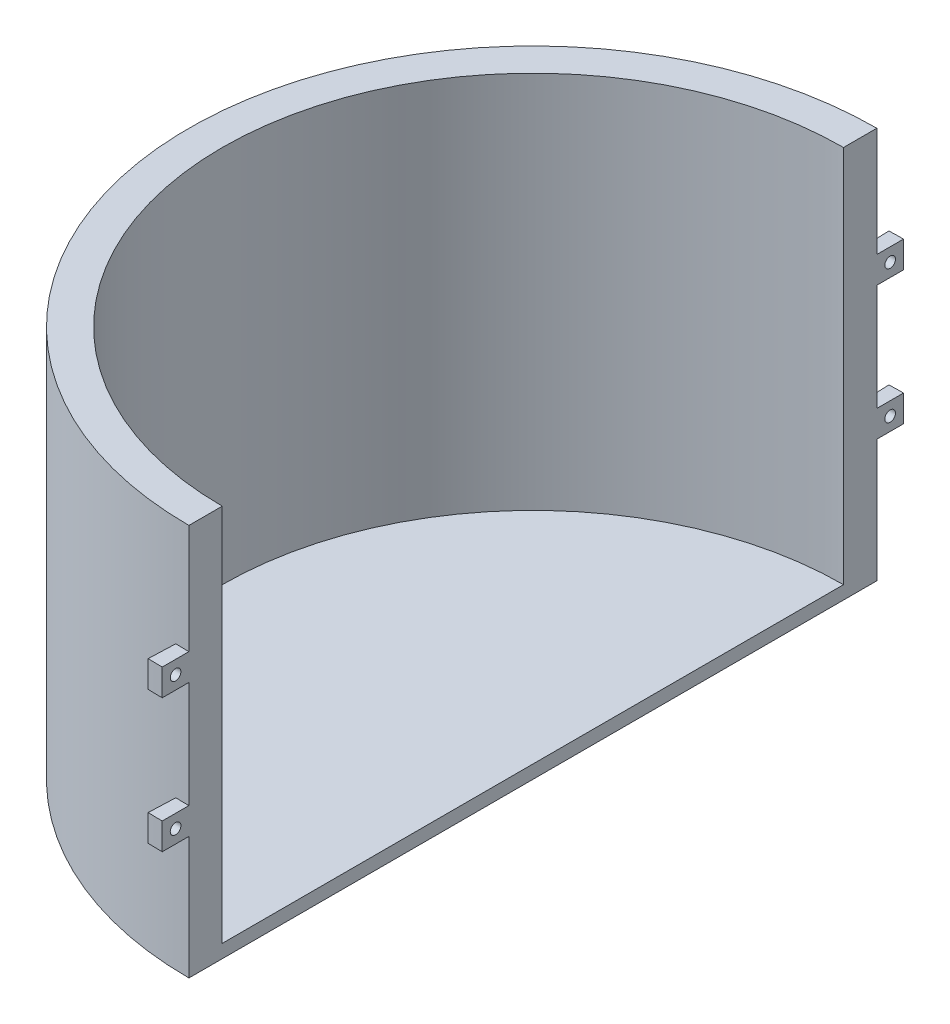
ISO-10303-21;
HEADER;
FILE_DESCRIPTION(('STEP AP214'),'2;1');
FILE_NAME('part.step','',(''),(''),'','','');
FILE_SCHEMA(('AUTOMOTIVE_DESIGN { 1 0 10303 214 1 1 1 1 }'));
ENDSEC;
DATA;
#1=APPLICATION_CONTEXT('core data for automotive mechanical design processes');
#2=APPLICATION_PROTOCOL_DEFINITION('international standard','automotive_design',2000,#1);
#3=PRODUCT_CONTEXT('',#1,'mechanical');
#4=PRODUCT('Part','Part','',(#3));
#5=PRODUCT_RELATED_PRODUCT_CATEGORY('part','',(#4));
#6=PRODUCT_DEFINITION_FORMATION('','',#4);
#7=PRODUCT_DEFINITION_CONTEXT('part definition',#1,'design');
#8=PRODUCT_DEFINITION('design','',#6,#7);
#9=PRODUCT_DEFINITION_SHAPE('','',#8);
#10=(LENGTH_UNIT() NAMED_UNIT(*) SI_UNIT(.MILLI.,.METRE.));
#11=(NAMED_UNIT(*) PLANE_ANGLE_UNIT() SI_UNIT($,.RADIAN.));
#12=(NAMED_UNIT(*) SI_UNIT($,.STERADIAN.) SOLID_ANGLE_UNIT());
#13=UNCERTAINTY_MEASURE_WITH_UNIT(LENGTH_MEASURE(1.E-05),#10,'distance_accuracy_value','');
#14=(GEOMETRIC_REPRESENTATION_CONTEXT(3) GLOBAL_UNCERTAINTY_ASSIGNED_CONTEXT((#13)) GLOBAL_UNIT_ASSIGNED_CONTEXT((#10,
#11,#12)) REPRESENTATION_CONTEXT('',''));
#15=CARTESIAN_POINT('',(0.,0.,0.));
#16=DIRECTION('',(0.,0.,1.));
#17=DIRECTION('',(1.,0.,0.));
#18=AXIS2_PLACEMENT_3D('',#15,#16,#17);
#19=CARTESIAN_POINT('',(0.,180.,129.));
#20=DIRECTION('',(-1.,0.,0.));
#21=DIRECTION('',(0.,0.,1.));
#22=AXIS2_PLACEMENT_3D('',#19,#20,#21);
#23=PLANE('',#22);
#24=CARTESIAN_POINT('',(0.,65.,134.));
#25=DIRECTION('',(1.,0.,0.));
#26=DIRECTION('',(0.,0.,1.));
#27=AXIS2_PLACEMENT_3D('',#24,#25,#26);
#28=CIRCLE('',#27,2.);
#29=CARTESIAN_POINT('',(0.,65.,136.));
#30=VERTEX_POINT('',#29);
#31=EDGE_CURVE('E431',#30,#30,#28,.T.);
#32=ORIENTED_EDGE('',*,*,#31,.F.);
#33=EDGE_LOOP('',(#32));
#34=FACE_BOUND('',#33,.T.);
#35=CARTESIAN_POINT('',(0.,115.,-134.));
#36=DIRECTION('',(1.,0.,0.));
#37=DIRECTION('',(0.,0.,1.));
#38=AXIS2_PLACEMENT_3D('',#35,#36,#37);
#39=CIRCLE('',#38,2.);
#40=CARTESIAN_POINT('',(0.,115.,-132.));
#41=VERTEX_POINT('',#40);
#42=EDGE_CURVE('E428',#41,#41,#39,.T.);
#43=ORIENTED_EDGE('',*,*,#42,.F.);
#44=EDGE_LOOP('',(#43));
#45=FACE_BOUND('',#44,.T.);
#46=CARTESIAN_POINT('',(0.,65.,-134.));
#47=DIRECTION('',(1.,0.,0.));
#48=DIRECTION('',(0.,0.,-1.));
#49=AXIS2_PLACEMENT_3D('',#46,#47,#48);
#50=CIRCLE('',#49,2.);
#51=CARTESIAN_POINT('',(0.,65.,-136.));
#52=VERTEX_POINT('',#51);
#53=EDGE_CURVE('E425',#52,#52,#50,.T.);
#54=ORIENTED_EDGE('',*,*,#53,.F.);
#55=EDGE_LOOP('',(#54));
#56=FACE_BOUND('',#55,.T.);
#57=CARTESIAN_POINT('',(0.,115.,134.));
#58=DIRECTION('',(1.,0.,0.));
#59=DIRECTION('',(0.,0.,-1.));
#60=AXIS2_PLACEMENT_3D('',#57,#58,#59);
#61=CIRCLE('',#60,2.);
#62=CARTESIAN_POINT('',(0.,115.,132.));
#63=VERTEX_POINT('',#62);
#64=EDGE_CURVE('E280',#63,#63,#61,.T.);
#65=ORIENTED_EDGE('',*,*,#64,.F.);
#66=EDGE_LOOP('',(#65));
#67=FACE_BOUND('',#66,.T.);
#68=DIRECTION('',(0.,-1.,0.));
#69=VECTOR('',#68,1.);
#70=CARTESIAN_POINT('',(0.,180.,-129.));
#71=LINE('',#70,#69);
#72=CARTESIAN_POINT('',(0.,161.,-129.));
#73=VERTEX_POINT('',#72);
#74=CARTESIAN_POINT('',(0.,120.,-129.));
#75=VERTEX_POINT('',#74);
#76=EDGE_CURVE('E252',#73,#75,#71,.T.);
#77=ORIENTED_EDGE('',*,*,#76,.F.);
#78=DIRECTION('',(0.,0.,1.));
#79=VECTOR('',#78,1.);
#80=CARTESIAN_POINT('',(0.,161.,129.));
#81=LINE('',#80,#79);
#82=CARTESIAN_POINT('',(0.,161.,-116.5));
#83=VERTEX_POINT('',#82);
#84=EDGE_CURVE('E238',#73,#83,#81,.T.);
#85=ORIENTED_EDGE('',*,*,#84,.T.);
#86=DIRECTION('',(0.,1.,0.));
#87=VECTOR('',#86,1.);
#88=CARTESIAN_POINT('',(0.,180.,-116.5));
#89=LINE('',#88,#87);
#90=CARTESIAN_POINT('',(0.,19.,-116.5));
#91=VERTEX_POINT('',#90);
#92=EDGE_CURVE('E111',#83,#91,#89,.F.);
#93=ORIENTED_EDGE('',*,*,#92,.T.);
#94=DIRECTION('',(0.,0.,1.));
#95=VECTOR('',#94,1.);
#96=CARTESIAN_POINT('',(0.,19.,129.));
#97=LINE('',#96,#95);
#98=CARTESIAN_POINT('',(0.,19.,116.5));
#99=VERTEX_POINT('',#98);
#100=EDGE_CURVE('E273',#91,#99,#97,.T.);
#101=ORIENTED_EDGE('',*,*,#100,.T.);
#102=DIRECTION('',(0.,-1.,0.));
#103=VECTOR('',#102,1.);
#104=CARTESIAN_POINT('',(0.,0.,116.5));
#105=LINE('',#104,#103);
#106=CARTESIAN_POINT('',(0.,161.,116.5));
#107=VERTEX_POINT('',#106);
#108=EDGE_CURVE('E411',#107,#99,#105,.T.);
#109=ORIENTED_EDGE('',*,*,#108,.F.);
#110=CARTESIAN_POINT('',(0.,161.,129.));
#111=VERTEX_POINT('',#110);
#112=EDGE_CURVE('E250',#107,#111,#81,.T.);
#113=ORIENTED_EDGE('',*,*,#112,.T.);
#114=DIRECTION('',(0.,-1.,0.));
#115=VECTOR('',#114,1.);
#116=CARTESIAN_POINT('',(0.,180.,129.));
#117=LINE('',#116,#115);
#118=CARTESIAN_POINT('',(0.,120.,129.));
#119=VERTEX_POINT('',#118);
#120=EDGE_CURVE('E255',#111,#119,#117,.T.);
#121=ORIENTED_EDGE('',*,*,#120,.T.);
#122=DIRECTION('',(0.,0.,-1.));
#123=VECTOR('',#122,1.);
#124=CARTESIAN_POINT('',(0.,120.,129.));
#125=LINE('',#124,#123);
#126=CARTESIAN_POINT('',(0.,120.,139.));
#127=VERTEX_POINT('',#126);
#128=EDGE_CURVE('E376',#127,#119,#125,.T.);
#129=ORIENTED_EDGE('',*,*,#128,.F.);
#130=DIRECTION('',(0.,-1.,0.));
#131=VECTOR('',#130,1.);
#132=CARTESIAN_POINT('',(0.,180.,139.));
#133=LINE('',#132,#131);
#134=CARTESIAN_POINT('',(0.,110.,139.));
#135=VERTEX_POINT('',#134);
#136=EDGE_CURVE('E359',#127,#135,#133,.T.);
#137=ORIENTED_EDGE('',*,*,#136,.T.);
#138=DIRECTION('',(0.,0.,-1.));
#139=VECTOR('',#138,1.);
#140=CARTESIAN_POINT('',(0.,110.,129.));
#141=LINE('',#140,#139);
#142=CARTESIAN_POINT('',(0.,110.,129.));
#143=VERTEX_POINT('',#142);
#144=EDGE_CURVE('E374',#135,#143,#141,.T.);
#145=ORIENTED_EDGE('',*,*,#144,.T.);
#146=CARTESIAN_POINT('',(0.,70.,129.));
#147=VERTEX_POINT('',#146);
#148=EDGE_CURVE('E262',#143,#147,#117,.T.);
#149=ORIENTED_EDGE('',*,*,#148,.T.);
#150=DIRECTION('',(0.,0.,1.));
#151=VECTOR('',#150,1.);
#152=CARTESIAN_POINT('',(0.,70.,129.));
#153=LINE('',#152,#151);
#154=CARTESIAN_POINT('',(0.,70.0000000000001,139.));
#155=VERTEX_POINT('',#154);
#156=EDGE_CURVE('E409',#147,#155,#153,.T.);
#157=ORIENTED_EDGE('',*,*,#156,.T.);
#158=DIRECTION('',(0.,-1.,0.));
#159=VECTOR('',#158,1.);
#160=CARTESIAN_POINT('',(0.,180.,139.));
#161=LINE('',#160,#159);
#162=CARTESIAN_POINT('',(0.,60.0000000000001,139.));
#163=VERTEX_POINT('',#162);
#164=EDGE_CURVE('E387',#155,#163,#161,.T.);
#165=ORIENTED_EDGE('',*,*,#164,.T.);
#166=DIRECTION('',(0.,0.,1.));
#167=VECTOR('',#166,1.);
#168=CARTESIAN_POINT('',(0.,60.0000000000001,129.));
#169=LINE('',#168,#167);
#170=CARTESIAN_POINT('',(0.,60.0000000000001,129.));
#171=VERTEX_POINT('',#170);
#172=EDGE_CURVE('E392',#171,#163,#169,.T.);
#173=ORIENTED_EDGE('',*,*,#172,.F.);
#174=CARTESIAN_POINT('',(0.,14.0000000000001,129.));
#175=VERTEX_POINT('',#174);
#176=EDGE_CURVE('E259',#171,#175,#117,.T.);
#177=ORIENTED_EDGE('',*,*,#176,.T.);
#178=DIRECTION('',(0.,0.,-1.));
#179=VECTOR('',#178,1.);
#180=CARTESIAN_POINT('',(0.,14.,129.));
#181=LINE('',#180,#179);
#182=CARTESIAN_POINT('',(0.,14.,-129.));
#183=VERTEX_POINT('',#182);
#184=EDGE_CURVE('E117',#175,#183,#181,.T.);
#185=ORIENTED_EDGE('',*,*,#184,.T.);
#186=CARTESIAN_POINT('',(0.,60.0000000000001,-129.));
#187=VERTEX_POINT('',#186);
#188=EDGE_CURVE('E264',#187,#183,#71,.T.);
#189=ORIENTED_EDGE('',*,*,#188,.F.);
#190=DIRECTION('',(0.,0.,-1.));
#191=VECTOR('',#190,1.);
#192=CARTESIAN_POINT('',(0.,60.0000000000001,-129.));
#193=LINE('',#192,#191);
#194=CARTESIAN_POINT('',(0.,60.0000000000001,-139.));
#195=VERTEX_POINT('',#194);
#196=EDGE_CURVE('E339',#187,#195,#193,.T.);
#197=ORIENTED_EDGE('',*,*,#196,.T.);
#198=DIRECTION('',(0.,-1.,0.));
#199=VECTOR('',#198,1.);
#200=CARTESIAN_POINT('',(0.,180.,-139.));
#201=LINE('',#200,#199);
#202=CARTESIAN_POINT('',(0.,70.,-139.));
#203=VERTEX_POINT('',#202);
#204=EDGE_CURVE('E323',#203,#195,#201,.T.);
#205=ORIENTED_EDGE('',*,*,#204,.F.);
#206=DIRECTION('',(0.,0.,-1.));
#207=VECTOR('',#206,1.);
#208=CARTESIAN_POINT('',(0.,70.,-129.));
#209=LINE('',#208,#207);
#210=CARTESIAN_POINT('',(0.,70.,-129.));
#211=VERTEX_POINT('',#210);
#212=EDGE_CURVE('E341',#211,#203,#209,.T.);
#213=ORIENTED_EDGE('',*,*,#212,.F.);
#214=CARTESIAN_POINT('',(0.,110.,-129.));
#215=VERTEX_POINT('',#214);
#216=EDGE_CURVE('E260',#215,#211,#71,.T.);
#217=ORIENTED_EDGE('',*,*,#216,.F.);
#218=DIRECTION('',(0.,0.,1.));
#219=VECTOR('',#218,1.);
#220=CARTESIAN_POINT('',(0.,110.,-129.));
#221=LINE('',#220,#219);
#222=CARTESIAN_POINT('',(0.,110.,-139.));
#223=VERTEX_POINT('',#222);
#224=EDGE_CURVE('E312',#223,#215,#221,.T.);
#225=ORIENTED_EDGE('',*,*,#224,.F.);
#226=DIRECTION('',(0.,-1.,0.));
#227=VECTOR('',#226,1.);
#228=CARTESIAN_POINT('',(0.,180.,-139.));
#229=LINE('',#228,#227);
#230=CARTESIAN_POINT('',(0.,120.,-139.));
#231=VERTEX_POINT('',#230);
#232=EDGE_CURVE('E291',#231,#223,#229,.T.);
#233=ORIENTED_EDGE('',*,*,#232,.F.);
#234=DIRECTION('',(0.,0.,1.));
#235=VECTOR('',#234,1.);
#236=CARTESIAN_POINT('',(0.,120.,-129.));
#237=LINE('',#236,#235);
#238=EDGE_CURVE('E258',#231,#75,#237,.T.);
#239=ORIENTED_EDGE('',*,*,#238,.T.);
#240=EDGE_LOOP('',(#77,#85,#93,#101,#109,#113,#121,#129,#137,#145,#149,#157,#165,#173,#177,#185,
#189,#197,#205,#213,#217,#225,#233,#239));
#241=FACE_BOUND('',#240,.T.);
#242=ADVANCED_FACE('F103',(#34,#45,#56,#67,#241),#23,.F.);
#243=CARTESIAN_POINT('',(0.,180.,0.));
#244=DIRECTION('',(0.,-1.,0.));
#245=DIRECTION('',(0.,0.,-1.));
#246=AXIS2_PLACEMENT_3D('',#243,#244,#245);
#247=CYLINDRICAL_SURFACE('',#246,129.);
#248=ORIENTED_EDGE('',*,*,#120,.F.);
#249=CARTESIAN_POINT('',(0.,161.,0.));
#250=DIRECTION('',(0.,-1.,0.));
#251=DIRECTION('',(0.,0.,-1.));
#252=AXIS2_PLACEMENT_3D('',#249,#250,#251);
#253=CIRCLE('',#252,129.);
#254=EDGE_CURVE('E241',#111,#73,#253,.T.);
#255=ORIENTED_EDGE('',*,*,#254,.T.);
#256=ORIENTED_EDGE('',*,*,#76,.T.);
#257=CARTESIAN_POINT('',(0.,120.,0.));
#258=DIRECTION('',(0.,-1.,0.));
#259=DIRECTION('',(0.,0.,-1.));
#260=AXIS2_PLACEMENT_3D('',#257,#258,#259);
#261=CIRCLE('',#260,129.);
#262=CARTESIAN_POINT('',(-4.99874816606519,120.,-128.903112905671));
#263=VERTEX_POINT('',#262);
#264=EDGE_CURVE('E124',#263,#75,#261,.T.);
#265=ORIENTED_EDGE('',*,*,#264,.F.);
#266=DIRECTION('',(0.,-1.,0.));
#267=VECTOR('',#266,1.);
#268=CARTESIAN_POINT('',(-4.99874816606519,120.,-128.903112905671));
#269=LINE('',#268,#267);
#270=CARTESIAN_POINT('',(-4.99874816606519,110.,-128.903112905671));
#271=VERTEX_POINT('',#270);
#272=EDGE_CURVE('E317',#263,#271,#269,.T.);
#273=ORIENTED_EDGE('',*,*,#272,.T.);
#274=CARTESIAN_POINT('',(0.,110.,0.));
#275=DIRECTION('',(0.,-1.,0.));
#276=DIRECTION('',(0.,0.,-1.));
#277=AXIS2_PLACEMENT_3D('',#274,#275,#276);
#278=CIRCLE('',#277,129.);
#279=EDGE_CURVE('E301',#271,#215,#278,.T.);
#280=ORIENTED_EDGE('',*,*,#279,.T.);
#281=ORIENTED_EDGE('',*,*,#216,.T.);
#282=CARTESIAN_POINT('',(0.,70.,0.));
#283=DIRECTION('',(0.,-1.,0.));
#284=DIRECTION('',(0.,0.,-1.));
#285=AXIS2_PLACEMENT_3D('',#282,#283,#284);
#286=CIRCLE('',#285,129.);
#287=CARTESIAN_POINT('',(-4.99874816606522,70.,-128.903112905671));
#288=VERTEX_POINT('',#287);
#289=EDGE_CURVE('E322',#288,#211,#286,.T.);
#290=ORIENTED_EDGE('',*,*,#289,.F.);
#291=DIRECTION('',(0.,-1.,0.));
#292=VECTOR('',#291,1.);
#293=CARTESIAN_POINT('',(-4.99874816606519,70.,-128.903112905671));
#294=LINE('',#293,#292);
#295=CARTESIAN_POINT('',(-4.99874816606519,60.,-128.903112905671));
#296=VERTEX_POINT('',#295);
#297=EDGE_CURVE('E334',#288,#296,#294,.T.);
#298=ORIENTED_EDGE('',*,*,#297,.T.);
#299=CARTESIAN_POINT('',(0.,60.,0.));
#300=DIRECTION('',(0.,-1.,0.));
#301=DIRECTION('',(0.,0.,-1.));
#302=AXIS2_PLACEMENT_3D('',#299,#300,#301);
#303=CIRCLE('',#302,129.);
#304=EDGE_CURVE('E315',#296,#187,#303,.T.);
#305=ORIENTED_EDGE('',*,*,#304,.T.);
#306=ORIENTED_EDGE('',*,*,#188,.T.);
#307=CARTESIAN_POINT('',(0.,14.,0.));
#308=DIRECTION('',(0.,1.,0.));
#309=DIRECTION('',(0.,0.,1.));
#310=AXIS2_PLACEMENT_3D('',#307,#308,#309);
#311=CIRCLE('',#310,129.);
#312=EDGE_CURVE('E13',#183,#175,#311,.T.);
#313=ORIENTED_EDGE('',*,*,#312,.T.);
#314=ORIENTED_EDGE('',*,*,#176,.F.);
#315=CARTESIAN_POINT('',(0.,60.,0.));
#316=DIRECTION('',(0.,-1.,0.));
#317=DIRECTION('',(-0.0387499857834649,0.,0.999248937253266));
#318=AXIS2_PLACEMENT_3D('',#315,#316,#317);
#319=CIRCLE('',#318,129.);
#320=CARTESIAN_POINT('',(-4.99874816606697,60.,128.903112905671));
#321=VERTEX_POINT('',#320);
#322=EDGE_CURVE('E382',#171,#321,#319,.T.);
#323=ORIENTED_EDGE('',*,*,#322,.T.);
#324=DIRECTION('',(0.,-1.,0.));
#325=VECTOR('',#324,1.);
#326=CARTESIAN_POINT('',(-4.99874816606697,70.,128.903112905671));
#327=LINE('',#326,#325);
#328=CARTESIAN_POINT('',(-4.99874816606697,70.,128.903112905671));
#329=VERTEX_POINT('',#328);
#330=EDGE_CURVE('E388',#329,#321,#327,.T.);
#331=ORIENTED_EDGE('',*,*,#330,.F.);
#332=CARTESIAN_POINT('',(0.,70.,0.));
#333=DIRECTION('',(0.,-1.,0.));
#334=DIRECTION('',(-0.0387499857834649,0.,0.999248937253266));
#335=AXIS2_PLACEMENT_3D('',#332,#333,#334);
#336=CIRCLE('',#335,129.);
#337=EDGE_CURVE('E400',#147,#329,#336,.T.);
#338=ORIENTED_EDGE('',*,*,#337,.F.);
#339=ORIENTED_EDGE('',*,*,#148,.F.);
#340=CARTESIAN_POINT('',(0.,110.,0.));
#341=DIRECTION('',(0.,-1.,0.));
#342=DIRECTION('',(-0.0387499857834649,0.,0.999248937253266));
#343=AXIS2_PLACEMENT_3D('',#340,#341,#342);
#344=CIRCLE('',#343,129.);
#345=CARTESIAN_POINT('',(-4.99874816606697,110.,128.903112905671));
#346=VERTEX_POINT('',#345);
#347=EDGE_CURVE('E355',#143,#346,#344,.T.);
#348=ORIENTED_EDGE('',*,*,#347,.T.);
#349=DIRECTION('',(0.,-1.,0.));
#350=VECTOR('',#349,1.);
#351=CARTESIAN_POINT('',(-4.99874816606697,120.,128.903112905671));
#352=LINE('',#351,#350);
#353=CARTESIAN_POINT('',(-4.99874816606697,120.,128.903112905671));
#354=VERTEX_POINT('',#353);
#355=EDGE_CURVE('E351',#354,#346,#352,.T.);
#356=ORIENTED_EDGE('',*,*,#355,.F.);
#357=CARTESIAN_POINT('',(0.,120.,0.));
#358=DIRECTION('',(0.,-1.,0.));
#359=DIRECTION('',(-0.0387499857834649,0.,0.999248937253266));
#360=AXIS2_PLACEMENT_3D('',#357,#358,#359);
#361=CIRCLE('',#360,129.);
#362=EDGE_CURVE('E347',#119,#354,#361,.T.);
#363=ORIENTED_EDGE('',*,*,#362,.F.);
#364=EDGE_LOOP('',(#248,#255,#256,#265,#273,#280,#281,#290,#298,#305,#306,#313,#314,#323,#331,
#338,#339,#348,#356,#363));
#365=FACE_BOUND('',#364,.T.);
#366=ADVANCED_FACE('F105',(#365),#247,.T.);
#367=CARTESIAN_POINT('',(0.,180.,0.));
#368=DIRECTION('',(0.,1.,0.));
#369=DIRECTION('',(0.,0.,1.));
#370=AXIS2_PLACEMENT_3D('',#367,#368,#369);
#371=CYLINDRICAL_SURFACE('',#370,116.5);
#372=CARTESIAN_POINT('',(0.,161.,0.));
#373=DIRECTION('',(0.,1.,0.));
#374=DIRECTION('',(0.,0.,1.));
#375=AXIS2_PLACEMENT_3D('',#372,#373,#374);
#376=CIRCLE('',#375,116.5);
#377=EDGE_CURVE('E244',#83,#107,#376,.T.);
#378=ORIENTED_EDGE('',*,*,#377,.T.);
#379=ORIENTED_EDGE('',*,*,#108,.T.);
#380=CARTESIAN_POINT('',(0.,19.,0.));
#381=DIRECTION('',(0.,1.,0.));
#382=DIRECTION('',(0.,0.,1.));
#383=AXIS2_PLACEMENT_3D('',#380,#381,#382);
#384=CIRCLE('',#383,116.5);
#385=EDGE_CURVE('E414',#91,#99,#384,.T.);
#386=ORIENTED_EDGE('',*,*,#385,.F.);
#387=ORIENTED_EDGE('',*,*,#92,.F.);
#388=EDGE_LOOP('',(#378,#379,#386,#387));
#389=FACE_BOUND('',#388,.T.);
#390=ADVANCED_FACE('F468',(#389),#371,.F.);
#391=CARTESIAN_POINT('',(0.,19.,0.));
#392=DIRECTION('',(0.,-1.,0.));
#393=DIRECTION('',(0.,0.,-1.));
#394=AXIS2_PLACEMENT_3D('',#391,#392,#393);
#395=PLANE('',#394);
#396=ORIENTED_EDGE('',*,*,#385,.T.);
#397=ORIENTED_EDGE('',*,*,#100,.F.);
#398=EDGE_LOOP('',(#396,#397));
#399=FACE_BOUND('',#398,.T.);
#400=ADVANCED_FACE('F474',(#399),#395,.F.);
#401=CARTESIAN_POINT('',(0.,70.,0.));
#402=DIRECTION('',(0.,1.,0.));
#403=DIRECTION('',(0.,0.,1.));
#404=AXIS2_PLACEMENT_3D('',#401,#402,#403);
#405=PLANE('',#404);
#406=ORIENTED_EDGE('',*,*,#156,.F.);
#407=ORIENTED_EDGE('',*,*,#337,.T.);
#408=DIRECTION('',(-0.0387499857834649,0.,0.999248937253266));
#409=VECTOR('',#408,1.);
#410=CARTESIAN_POINT('',(-4.99874816606697,70.,128.903112905671));
#411=LINE('',#410,#409);
#412=CARTESIAN_POINT('',(-5.38624802390156,70.0000000000001,138.895602278204));
#413=VERTEX_POINT('',#412);
#414=EDGE_CURVE('E407',#329,#413,#411,.T.);
#415=ORIENTED_EDGE('',*,*,#414,.T.);
#416=CARTESIAN_POINT('',(0.,70.0000000000001,0.));
#417=DIRECTION('',(0.,-1.,0.));
#418=DIRECTION('',(0.,0.,-1.));
#419=AXIS2_PLACEMENT_3D('',#416,#417,#418);
#420=CIRCLE('',#419,139.);
#421=EDGE_CURVE('E393',#155,#413,#420,.T.);
#422=ORIENTED_EDGE('',*,*,#421,.F.);
#423=EDGE_LOOP('',(#406,#407,#415,#422));
#424=FACE_BOUND('',#423,.T.);
#425=ADVANCED_FACE('F477',(#424),#405,.T.);
#426=CARTESIAN_POINT('',(-4.99874816606697,65.,128.903112905671));
#427=DIRECTION('',(-0.999248937253266,0.,-0.0387499857834649));
#428=DIRECTION('',(0.,-1.,0.));
#429=AXIS2_PLACEMENT_3D('',#426,#427,#428);
#430=PLANE('',#429);
#431=CARTESIAN_POINT('',(-5.196400918131,65.,134.));
#432=DIRECTION('',(-0.999248937253266,0.,-0.0387499857834649));
#433=DIRECTION('',(0.0387499857834649,0.,-0.999248937253266));
#434=AXIS2_PLACEMENT_3D('',#431,#432,#433);
#435=ELLIPSE('',#434,2.00150325453194,2.);
#436=CARTESIAN_POINT('',(-5.11884269547233,65.,132.));
#437=VERTEX_POINT('',#436);
#438=EDGE_CURVE('E285',#437,#437,#435,.T.);
#439=ORIENTED_EDGE('',*,*,#438,.F.);
#440=EDGE_LOOP('',(#439));
#441=FACE_BOUND('',#440,.T.);
#442=ORIENTED_EDGE('',*,*,#414,.F.);
#443=ORIENTED_EDGE('',*,*,#330,.T.);
#444=DIRECTION('',(-0.0387499857834649,0.,0.999248937253266));
#445=VECTOR('',#444,1.);
#446=CARTESIAN_POINT('',(-4.99874816606697,60.,128.903112905671));
#447=LINE('',#446,#445);
#448=CARTESIAN_POINT('',(-5.38624802390156,60.0000000000001,138.895602278204));
#449=VERTEX_POINT('',#448);
#450=EDGE_CURVE('E405',#321,#449,#447,.T.);
#451=ORIENTED_EDGE('',*,*,#450,.T.);
#452=DIRECTION('',(0.,-1.,0.));
#453=VECTOR('',#452,1.);
#454=CARTESIAN_POINT('',(-5.38624802390156,180.,138.895602278204));
#455=LINE('',#454,#453);
#456=EDGE_CURVE('E389',#413,#449,#455,.T.);
#457=ORIENTED_EDGE('',*,*,#456,.F.);
#458=EDGE_LOOP('',(#442,#443,#451,#457));
#459=FACE_BOUND('',#458,.T.);
#460=ADVANCED_FACE('F480',(#441,#459),#430,.T.);
#461=CARTESIAN_POINT('',(0.,60.,0.));
#462=DIRECTION('',(0.,1.,0.));
#463=DIRECTION('',(0.,0.,1.));
#464=AXIS2_PLACEMENT_3D('',#461,#462,#463);
#465=PLANE('',#464);
#466=ORIENTED_EDGE('',*,*,#450,.F.);
#467=ORIENTED_EDGE('',*,*,#322,.F.);
#468=ORIENTED_EDGE('',*,*,#172,.T.);
#469=CARTESIAN_POINT('',(0.,60.0000000000001,0.));
#470=DIRECTION('',(0.,-1.,0.));
#471=DIRECTION('',(0.,0.,-1.));
#472=AXIS2_PLACEMENT_3D('',#469,#470,#471);
#473=CIRCLE('',#472,139.);
#474=EDGE_CURVE('E384',#163,#449,#473,.T.);
#475=ORIENTED_EDGE('',*,*,#474,.T.);
#476=EDGE_LOOP('',(#466,#467,#468,#475));
#477=FACE_BOUND('',#476,.T.);
#478=ADVANCED_FACE('F484',(#477),#465,.F.);
#479=CARTESIAN_POINT('',(0.,180.,0.));
#480=DIRECTION('',(0.,-1.,0.));
#481=DIRECTION('',(0.,0.,-1.));
#482=AXIS2_PLACEMENT_3D('',#479,#480,#481);
#483=CYLINDRICAL_SURFACE('',#482,139.);
#484=ORIENTED_EDGE('',*,*,#474,.F.);
#485=ORIENTED_EDGE('',*,*,#164,.F.);
#486=ORIENTED_EDGE('',*,*,#421,.T.);
#487=ORIENTED_EDGE('',*,*,#456,.T.);
#488=EDGE_LOOP('',(#484,#485,#486,#487));
#489=FACE_BOUND('',#488,.T.);
#490=ADVANCED_FACE('F488',(#489),#483,.T.);
#491=CARTESIAN_POINT('',(0.,120.,0.));
#492=DIRECTION('',(0.,1.,0.));
#493=DIRECTION('',(0.,0.,1.));
#494=AXIS2_PLACEMENT_3D('',#491,#492,#493);
#495=PLANE('',#494);
#496=DIRECTION('',(0.0387499857834649,0.,-0.999248937253266));
#497=VECTOR('',#496,1.);
#498=CARTESIAN_POINT('',(-4.99874816606697,120.,128.903112905671));
#499=LINE('',#498,#497);
#500=CARTESIAN_POINT('',(-5.38624802390156,120.,138.895602278204));
#501=VERTEX_POINT('',#500);
#502=EDGE_CURVE('E379',#501,#354,#499,.T.);
#503=ORIENTED_EDGE('',*,*,#502,.F.);
#504=CARTESIAN_POINT('',(0.,120.,0.));
#505=DIRECTION('',(0.,-1.,0.));
#506=DIRECTION('',(0.,0.,-1.));
#507=AXIS2_PLACEMENT_3D('',#504,#505,#506);
#508=CIRCLE('',#507,139.);
#509=EDGE_CURVE('E367',#127,#501,#508,.T.);
#510=ORIENTED_EDGE('',*,*,#509,.F.);
#511=ORIENTED_EDGE('',*,*,#128,.T.);
#512=ORIENTED_EDGE('',*,*,#362,.T.);
#513=EDGE_LOOP('',(#503,#510,#511,#512));
#514=FACE_BOUND('',#513,.T.);
#515=ADVANCED_FACE('F492',(#514),#495,.T.);
#516=CARTESIAN_POINT('',(0.,110.,0.));
#517=DIRECTION('',(0.,1.,0.));
#518=DIRECTION('',(0.,0.,1.));
#519=AXIS2_PLACEMENT_3D('',#516,#517,#518);
#520=PLANE('',#519);
#521=ORIENTED_EDGE('',*,*,#144,.F.);
#522=CARTESIAN_POINT('',(0.,110.,0.));
#523=DIRECTION('',(0.,-1.,0.));
#524=DIRECTION('',(0.,0.,-1.));
#525=AXIS2_PLACEMENT_3D('',#522,#523,#524);
#526=CIRCLE('',#525,139.);
#527=CARTESIAN_POINT('',(-5.38624802390156,110.,138.895602278204));
#528=VERTEX_POINT('',#527);
#529=EDGE_CURVE('E345',#135,#528,#526,.T.);
#530=ORIENTED_EDGE('',*,*,#529,.T.);
#531=DIRECTION('',(0.0387499857834649,0.,-0.999248937253266));
#532=VECTOR('',#531,1.);
#533=CARTESIAN_POINT('',(-4.99874816606697,110.,128.903112905671));
#534=LINE('',#533,#532);
#535=EDGE_CURVE('E350',#528,#346,#534,.T.);
#536=ORIENTED_EDGE('',*,*,#535,.T.);
#537=ORIENTED_EDGE('',*,*,#347,.F.);
#538=EDGE_LOOP('',(#521,#530,#536,#537));
#539=FACE_BOUND('',#538,.T.);
#540=ADVANCED_FACE('F498',(#539),#520,.F.);
#541=CARTESIAN_POINT('',(-4.99874816606697,115.,128.903112905671));
#542=DIRECTION('',(-0.999248937253266,0.,-0.0387499857834649));
#543=DIRECTION('',(0.,-1.,0.));
#544=AXIS2_PLACEMENT_3D('',#541,#542,#543);
#545=PLANE('',#544);
#546=CARTESIAN_POINT('',(-5.196400918131,115.,134.));
#547=DIRECTION('',(-0.999248937253266,0.,-0.0387499857834649));
#548=DIRECTION('',(0.0387499857834649,0.,-0.999248937253266));
#549=AXIS2_PLACEMENT_3D('',#546,#547,#548);
#550=ELLIPSE('',#549,2.00150325453194,2.);
#551=CARTESIAN_POINT('',(-5.11884269547233,115.,132.));
#552=VERTEX_POINT('',#551);
#553=EDGE_CURVE('E283',#552,#552,#550,.T.);
#554=ORIENTED_EDGE('',*,*,#553,.F.);
#555=EDGE_LOOP('',(#554));
#556=FACE_BOUND('',#555,.T.);
#557=DIRECTION('',(0.,-1.,0.));
#558=VECTOR('',#557,1.);
#559=CARTESIAN_POINT('',(-5.38624802390156,180.,138.895602278204));
#560=LINE('',#559,#558);
#561=EDGE_CURVE('E363',#501,#528,#560,.T.);
#562=ORIENTED_EDGE('',*,*,#561,.F.);
#563=ORIENTED_EDGE('',*,*,#502,.T.);
#564=ORIENTED_EDGE('',*,*,#355,.T.);
#565=ORIENTED_EDGE('',*,*,#535,.F.);
#566=EDGE_LOOP('',(#562,#563,#564,#565));
#567=FACE_BOUND('',#566,.T.);
#568=ADVANCED_FACE('F494',(#556,#567),#545,.T.);
#569=CARTESIAN_POINT('',(0.,180.,0.));
#570=DIRECTION('',(0.,-1.,0.));
#571=DIRECTION('',(0.,0.,-1.));
#572=AXIS2_PLACEMENT_3D('',#569,#570,#571);
#573=CYLINDRICAL_SURFACE('',#572,139.);
#574=ORIENTED_EDGE('',*,*,#529,.F.);
#575=ORIENTED_EDGE('',*,*,#136,.F.);
#576=ORIENTED_EDGE('',*,*,#509,.T.);
#577=ORIENTED_EDGE('',*,*,#561,.T.);
#578=EDGE_LOOP('',(#574,#575,#576,#577));
#579=FACE_BOUND('',#578,.T.);
#580=ADVANCED_FACE('F497',(#579),#573,.T.);
#581=CARTESIAN_POINT('',(0.,70.,0.));
#582=DIRECTION('',(0.,1.,0.));
#583=DIRECTION('',(0.,0.,1.));
#584=AXIS2_PLACEMENT_3D('',#581,#582,#583);
#585=PLANE('',#584);
#586=DIRECTION('',(-0.0387499857834513,0.,-0.999248937253266));
#587=VECTOR('',#586,1.);
#588=CARTESIAN_POINT('',(-4.99874816606522,70.,-128.903112905671));
#589=LINE('',#588,#587);
#590=CARTESIAN_POINT('',(-5.3862480238997,70.,-138.895602278204));
#591=VERTEX_POINT('',#590);
#592=EDGE_CURVE('E343',#288,#591,#589,.T.);
#593=ORIENTED_EDGE('',*,*,#592,.F.);
#594=ORIENTED_EDGE('',*,*,#289,.T.);
#595=ORIENTED_EDGE('',*,*,#212,.T.);
#596=CARTESIAN_POINT('',(0.,70.,0.));
#597=DIRECTION('',(0.,-1.,0.));
#598=DIRECTION('',(0.,0.,-1.));
#599=AXIS2_PLACEMENT_3D('',#596,#597,#598);
#600=CIRCLE('',#599,139.);
#601=EDGE_CURVE('E327',#591,#203,#600,.T.);
#602=ORIENTED_EDGE('',*,*,#601,.F.);
#603=EDGE_LOOP('',(#593,#594,#595,#602));
#604=FACE_BOUND('',#603,.T.);
#605=ADVANCED_FACE('F508',(#604),#585,.T.);
#606=CARTESIAN_POINT('',(0.,60.,0.));
#607=DIRECTION('',(0.,1.,0.));
#608=DIRECTION('',(0.,0.,1.));
#609=AXIS2_PLACEMENT_3D('',#606,#607,#608);
#610=PLANE('',#609);
#611=ORIENTED_EDGE('',*,*,#196,.F.);
#612=ORIENTED_EDGE('',*,*,#304,.F.);
#613=DIRECTION('',(-0.0387499857834511,0.,-0.999248937253266));
#614=VECTOR('',#613,1.);
#615=CARTESIAN_POINT('',(-4.99874816606519,60.,-128.903112905671));
#616=LINE('',#615,#614);
#617=CARTESIAN_POINT('',(-5.3862480238997,60.0000000000001,-138.895602278204));
#618=VERTEX_POINT('',#617);
#619=EDGE_CURVE('E326',#296,#618,#616,.T.);
#620=ORIENTED_EDGE('',*,*,#619,.T.);
#621=CARTESIAN_POINT('',(0.,60.0000000000001,0.));
#622=DIRECTION('',(0.,-1.,0.));
#623=DIRECTION('',(0.,0.,-1.));
#624=AXIS2_PLACEMENT_3D('',#621,#622,#623);
#625=CIRCLE('',#624,139.);
#626=EDGE_CURVE('E318',#618,#195,#625,.T.);
#627=ORIENTED_EDGE('',*,*,#626,.T.);
#628=EDGE_LOOP('',(#611,#612,#620,#627));
#629=FACE_BOUND('',#628,.T.);
#630=ADVANCED_FACE('F512',(#629),#610,.F.);
#631=CARTESIAN_POINT('',(-4.99874816606519,65.,-128.903112905671));
#632=DIRECTION('',(0.999248937253266,0.,-0.0387499857834511));
#633=DIRECTION('',(0.,-1.,0.));
#634=AXIS2_PLACEMENT_3D('',#631,#632,#633);
#635=PLANE('',#634);
#636=CARTESIAN_POINT('',(-5.19640091812915,65.,-134.));
#637=DIRECTION('',(0.999248937253266,0.,-0.0387499857834511));
#638=DIRECTION('',(0.0387499857834511,0.,0.999248937253266));
#639=AXIS2_PLACEMENT_3D('',#636,#637,#638);
#640=ELLIPSE('',#639,2.00150325453194,2.);
#641=CARTESIAN_POINT('',(-5.1188426954705,65.,-132.));
#642=VERTEX_POINT('',#641);
#643=EDGE_CURVE('E279',#642,#642,#640,.F.);
#644=ORIENTED_EDGE('',*,*,#643,.F.);
#645=EDGE_LOOP('',(#644));
#646=FACE_BOUND('',#645,.T.);
#647=ORIENTED_EDGE('',*,*,#297,.F.);
#648=ORIENTED_EDGE('',*,*,#592,.T.);
#649=DIRECTION('',(0.,-1.,0.));
#650=VECTOR('',#649,1.);
#651=CARTESIAN_POINT('',(-5.3862480238997,180.,-138.895602278204));
#652=LINE('',#651,#650);
#653=EDGE_CURVE('E321',#591,#618,#652,.T.);
#654=ORIENTED_EDGE('',*,*,#653,.T.);
#655=ORIENTED_EDGE('',*,*,#619,.F.);
#656=EDGE_LOOP('',(#647,#648,#654,#655));
#657=FACE_BOUND('',#656,.T.);
#658=ADVANCED_FACE('F460',(#646,#657),#635,.F.);
#659=CARTESIAN_POINT('',(0.,180.,0.));
#660=DIRECTION('',(0.,-1.,0.));
#661=DIRECTION('',(0.,0.,-1.));
#662=AXIS2_PLACEMENT_3D('',#659,#660,#661);
#663=CYLINDRICAL_SURFACE('',#662,139.);
#664=ORIENTED_EDGE('',*,*,#626,.F.);
#665=ORIENTED_EDGE('',*,*,#653,.F.);
#666=ORIENTED_EDGE('',*,*,#601,.T.);
#667=ORIENTED_EDGE('',*,*,#204,.T.);
#668=EDGE_LOOP('',(#664,#665,#666,#667));
#669=FACE_BOUND('',#668,.T.);
#670=ADVANCED_FACE('F452',(#669),#663,.T.);
#671=CARTESIAN_POINT('',(0.,120.,0.));
#672=DIRECTION('',(0.,1.,0.));
#673=DIRECTION('',(0.,0.,1.));
#674=AXIS2_PLACEMENT_3D('',#671,#672,#673);
#675=PLANE('',#674);
#676=ORIENTED_EDGE('',*,*,#238,.F.);
#677=CARTESIAN_POINT('',(0.,120.,0.));
#678=DIRECTION('',(0.,-1.,0.));
#679=DIRECTION('',(0.,0.,-1.));
#680=AXIS2_PLACEMENT_3D('',#677,#678,#679);
#681=CIRCLE('',#680,139.);
#682=CARTESIAN_POINT('',(-5.3862480238997,120.,-138.895602278204));
#683=VERTEX_POINT('',#682);
#684=EDGE_CURVE('E297',#683,#231,#681,.T.);
#685=ORIENTED_EDGE('',*,*,#684,.F.);
#686=DIRECTION('',(0.0387499857834513,0.,0.999248937253266));
#687=VECTOR('',#686,1.);
#688=CARTESIAN_POINT('',(-4.99874816606522,120.,-128.903112905671));
#689=LINE('',#688,#687);
#690=EDGE_CURVE('E311',#683,#263,#689,.T.);
#691=ORIENTED_EDGE('',*,*,#690,.T.);
#692=ORIENTED_EDGE('',*,*,#264,.T.);
#693=EDGE_LOOP('',(#676,#685,#691,#692));
#694=FACE_BOUND('',#693,.T.);
#695=ADVANCED_FACE('F450',(#694),#675,.T.);
#696=CARTESIAN_POINT('',(-4.99874816606519,115.,-128.903112905671));
#697=DIRECTION('',(0.999248937253266,0.,-0.0387499857834511));
#698=DIRECTION('',(0.,-1.,0.));
#699=AXIS2_PLACEMENT_3D('',#696,#697,#698);
#700=PLANE('',#699);
#701=CARTESIAN_POINT('',(-5.19640091812915,115.,-134.));
#702=DIRECTION('',(0.999248937253266,0.,-0.0387499857834511));
#703=DIRECTION('',(0.0387499857834511,0.,0.999248937253266));
#704=AXIS2_PLACEMENT_3D('',#701,#702,#703);
#705=ELLIPSE('',#704,2.00150325453194,2.);
#706=CARTESIAN_POINT('',(-5.1188426954705,115.,-132.));
#707=VERTEX_POINT('',#706);
#708=EDGE_CURVE('E276',#707,#707,#705,.F.);
#709=ORIENTED_EDGE('',*,*,#708,.F.);
#710=EDGE_LOOP('',(#709));
#711=FACE_BOUND('',#710,.T.);
#712=ORIENTED_EDGE('',*,*,#690,.F.);
#713=DIRECTION('',(0.,-1.,0.));
#714=VECTOR('',#713,1.);
#715=CARTESIAN_POINT('',(-5.3862480238997,180.,-138.895602278204));
#716=LINE('',#715,#714);
#717=CARTESIAN_POINT('',(-5.3862480238997,110.,-138.895602278204));
#718=VERTEX_POINT('',#717);
#719=EDGE_CURVE('E303',#683,#718,#716,.T.);
#720=ORIENTED_EDGE('',*,*,#719,.T.);
#721=DIRECTION('',(0.0387499857834511,0.,0.999248937253266));
#722=VECTOR('',#721,1.);
#723=CARTESIAN_POINT('',(-4.99874816606519,110.,-128.903112905671));
#724=LINE('',#723,#722);
#725=EDGE_CURVE('E308',#718,#271,#724,.T.);
#726=ORIENTED_EDGE('',*,*,#725,.T.);
#727=ORIENTED_EDGE('',*,*,#272,.F.);
#728=EDGE_LOOP('',(#712,#720,#726,#727));
#729=FACE_BOUND('',#728,.T.);
#730=ADVANCED_FACE('F442',(#711,#729),#700,.F.);
#731=CARTESIAN_POINT('',(0.,110.,0.));
#732=DIRECTION('',(0.,1.,0.));
#733=DIRECTION('',(0.,0.,1.));
#734=AXIS2_PLACEMENT_3D('',#731,#732,#733);
#735=PLANE('',#734);
#736=ORIENTED_EDGE('',*,*,#725,.F.);
#737=CARTESIAN_POINT('',(0.,110.,0.));
#738=DIRECTION('',(0.,-1.,0.));
#739=DIRECTION('',(0.,0.,-1.));
#740=AXIS2_PLACEMENT_3D('',#737,#738,#739);
#741=CIRCLE('',#740,139.);
#742=EDGE_CURVE('E287',#718,#223,#741,.T.);
#743=ORIENTED_EDGE('',*,*,#742,.T.);
#744=ORIENTED_EDGE('',*,*,#224,.T.);
#745=ORIENTED_EDGE('',*,*,#279,.F.);
#746=EDGE_LOOP('',(#736,#743,#744,#745));
#747=FACE_BOUND('',#746,.T.);
#748=ADVANCED_FACE('F444',(#747),#735,.F.);
#749=CARTESIAN_POINT('',(0.,180.,0.));
#750=DIRECTION('',(0.,-1.,0.));
#751=DIRECTION('',(0.,0.,-1.));
#752=AXIS2_PLACEMENT_3D('',#749,#750,#751);
#753=CYLINDRICAL_SURFACE('',#752,139.);
#754=ORIENTED_EDGE('',*,*,#742,.F.);
#755=ORIENTED_EDGE('',*,*,#719,.F.);
#756=ORIENTED_EDGE('',*,*,#684,.T.);
#757=ORIENTED_EDGE('',*,*,#232,.T.);
#758=EDGE_LOOP('',(#754,#755,#756,#757));
#759=FACE_BOUND('',#758,.T.);
#760=ADVANCED_FACE('F447',(#759),#753,.T.);
#761=CARTESIAN_POINT('',(-10.,115.,-134.));
#762=DIRECTION('',(1.,0.,0.));
#763=DIRECTION('',(0.,0.,-1.));
#764=AXIS2_PLACEMENT_3D('',#761,#762,#763);
#765=CYLINDRICAL_SURFACE('',#764,2.);
#766=ORIENTED_EDGE('',*,*,#708,.T.);
#767=EDGE_LOOP('',(#766));
#768=FACE_BOUND('',#767,.T.);
#769=ORIENTED_EDGE('',*,*,#42,.T.);
#770=EDGE_LOOP('',(#769));
#771=FACE_BOUND('',#770,.T.);
#772=ADVANCED_FACE('F562',(#768,#771),#765,.F.);
#773=CARTESIAN_POINT('',(-10.,65.,-134.));
#774=DIRECTION('',(1.,0.,0.));
#775=DIRECTION('',(0.,0.,-1.));
#776=AXIS2_PLACEMENT_3D('',#773,#774,#775);
#777=CYLINDRICAL_SURFACE('',#776,2.);
#778=ORIENTED_EDGE('',*,*,#643,.T.);
#779=EDGE_LOOP('',(#778));
#780=FACE_BOUND('',#779,.T.);
#781=ORIENTED_EDGE('',*,*,#53,.T.);
#782=EDGE_LOOP('',(#781));
#783=FACE_BOUND('',#782,.T.);
#784=ADVANCED_FACE('F647',(#780,#783),#777,.F.);
#785=CARTESIAN_POINT('',(-10.,115.,134.));
#786=DIRECTION('',(1.,0.,0.));
#787=DIRECTION('',(0.,0.,-1.));
#788=AXIS2_PLACEMENT_3D('',#785,#786,#787);
#789=CYLINDRICAL_SURFACE('',#788,2.);
#790=ORIENTED_EDGE('',*,*,#553,.T.);
#791=EDGE_LOOP('',(#790));
#792=FACE_BOUND('',#791,.T.);
#793=ORIENTED_EDGE('',*,*,#64,.T.);
#794=EDGE_LOOP('',(#793));
#795=FACE_BOUND('',#794,.T.);
#796=ADVANCED_FACE('F650',(#792,#795),#789,.F.);
#797=CARTESIAN_POINT('',(-10.,65.,134.));
#798=DIRECTION('',(1.,0.,0.));
#799=DIRECTION('',(0.,0.,-1.));
#800=AXIS2_PLACEMENT_3D('',#797,#798,#799);
#801=CYLINDRICAL_SURFACE('',#800,2.);
#802=ORIENTED_EDGE('',*,*,#438,.T.);
#803=EDGE_LOOP('',(#802));
#804=FACE_BOUND('',#803,.T.);
#805=ORIENTED_EDGE('',*,*,#31,.T.);
#806=EDGE_LOOP('',(#805));
#807=FACE_BOUND('',#806,.T.);
#808=ADVANCED_FACE('F610',(#804,#807),#801,.F.);
#809=CARTESIAN_POINT('',(-129.000025,161.,-129.));
#810=DIRECTION('',(0.,-1.,0.));
#811=DIRECTION('',(0.,0.,-1.));
#812=AXIS2_PLACEMENT_3D('',#809,#810,#811);
#813=PLANE('',#812);
#814=ORIENTED_EDGE('',*,*,#377,.F.);
#815=ORIENTED_EDGE('',*,*,#84,.F.);
#816=ORIENTED_EDGE('',*,*,#254,.F.);
#817=ORIENTED_EDGE('',*,*,#112,.F.);
#818=EDGE_LOOP('',(#814,#815,#816,#817));
#819=FACE_BOUND('',#818,.T.);
#820=ADVANCED_FACE('F240',(#819),#813,.F.);
#821=CARTESIAN_POINT('',(-129.000025,14.,129.));
#822=DIRECTION('',(0.,1.,0.));
#823=DIRECTION('',(0.,0.,1.));
#824=AXIS2_PLACEMENT_3D('',#821,#822,#823);
#825=PLANE('',#824);
#826=ORIENTED_EDGE('',*,*,#312,.F.);
#827=ORIENTED_EDGE('',*,*,#184,.F.);
#828=EDGE_LOOP('',(#826,#827));
#829=FACE_BOUND('',#828,.T.);
#830=ADVANCED_FACE('F634',(#829),#825,.F.);
#831=CLOSED_SHELL('',(#242,#366,#390,#400,#425,#460,#478,#490,#515,#540,#568,#580,#605,#630,
#658,#670,#695,#730,#748,#760,#772,#784,#796,#808,#820,#830));
#832=MANIFOLD_SOLID_BREP('B2',#831);
#833=ADVANCED_BREP_SHAPE_REPRESENTATION('',(#18,#832),#14);
#834=SHAPE_DEFINITION_REPRESENTATION(#9,#833);
ENDSEC;
END-ISO-10303-21;
